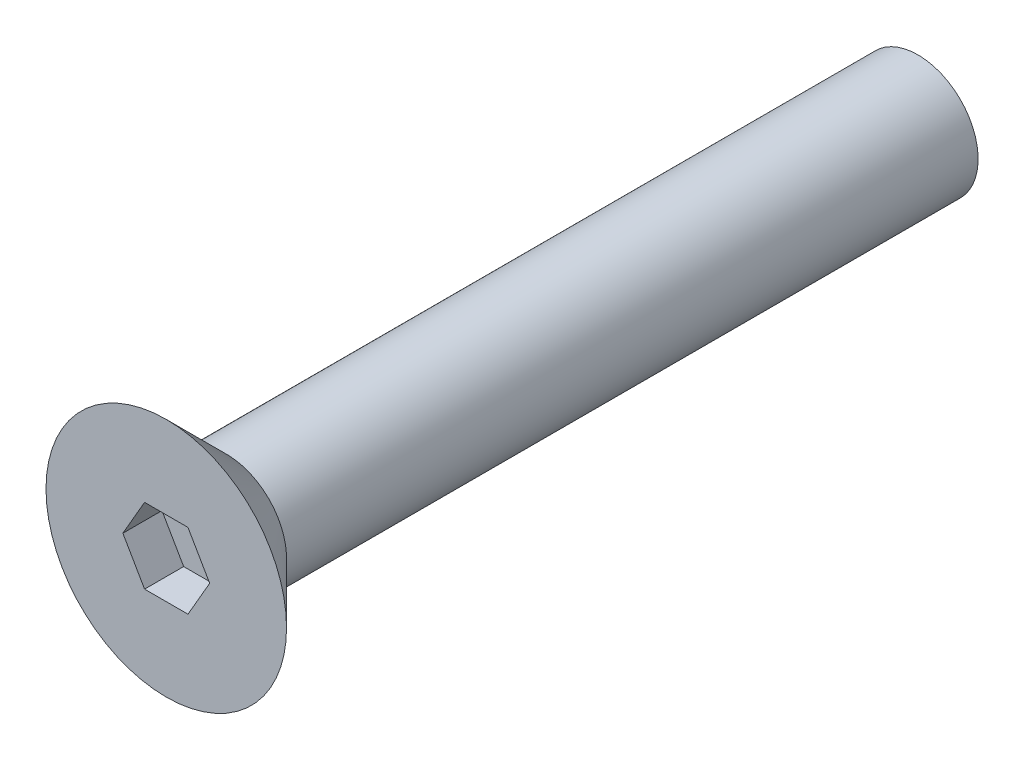
ISO-10303-21;
HEADER;
FILE_DESCRIPTION(('STEP AP214'),'2;1');
FILE_NAME('part.step','',(''),(''),'','','');
FILE_SCHEMA(('AUTOMOTIVE_DESIGN { 1 0 10303 214 1 1 1 1 }'));
ENDSEC;
DATA;
#1=APPLICATION_CONTEXT('core data for automotive mechanical design processes');
#2=APPLICATION_PROTOCOL_DEFINITION('international standard','automotive_design',2000,#1);
#3=PRODUCT_CONTEXT('',#1,'mechanical');
#4=PRODUCT('Part','Part','',(#3));
#5=PRODUCT_RELATED_PRODUCT_CATEGORY('part','',(#4));
#6=PRODUCT_DEFINITION_FORMATION('','',#4);
#7=PRODUCT_DEFINITION_CONTEXT('part definition',#1,'design');
#8=PRODUCT_DEFINITION('design','',#6,#7);
#9=PRODUCT_DEFINITION_SHAPE('','',#8);
#10=(LENGTH_UNIT() NAMED_UNIT(*) SI_UNIT(.MILLI.,.METRE.));
#11=(NAMED_UNIT(*) PLANE_ANGLE_UNIT() SI_UNIT($,.RADIAN.));
#12=(NAMED_UNIT(*) SI_UNIT($,.STERADIAN.) SOLID_ANGLE_UNIT());
#13=UNCERTAINTY_MEASURE_WITH_UNIT(LENGTH_MEASURE(1.E-05),#10,'distance_accuracy_value','');
#14=(GEOMETRIC_REPRESENTATION_CONTEXT(3) GLOBAL_UNCERTAINTY_ASSIGNED_CONTEXT((#13)) GLOBAL_UNIT_ASSIGNED_CONTEXT((#10,
#11,#12)) REPRESENTATION_CONTEXT('',''));
#15=CARTESIAN_POINT('',(0.,0.,0.));
#16=DIRECTION('',(0.,0.,1.));
#17=DIRECTION('',(1.,0.,0.));
#18=AXIS2_PLACEMENT_3D('',#15,#16,#17);
#19=CARTESIAN_POINT('',(0.,0.,-1.3));
#20=DIRECTION('',(0.,0.,1.));
#21=DIRECTION('',(1.,0.,0.));
#22=AXIS2_PLACEMENT_3D('',#19,#20,#21);
#23=PLANE('',#22);
#24=DIRECTION('',(-0.50000000000019,0.866025403784329,0.));
#25=VECTOR('',#24,1.);
#26=CARTESIAN_POINT('',(1.443375672974,0.,-1.3));
#27=LINE('',#26,#25);
#28=CARTESIAN_POINT('',(1.443375672974,0.,-1.3));
#29=VERTEX_POINT('',#28);
#30=CARTESIAN_POINT('',(0.721687836487,1.25,-1.3));
#31=VERTEX_POINT('',#30);
#32=EDGE_CURVE('E9',#29,#31,#27,.T.);
#33=ORIENTED_EDGE('',*,*,#32,.T.);
#34=DIRECTION('',(-1.,0.,0.));
#35=VECTOR('',#34,1.);
#36=CARTESIAN_POINT('',(0.721687836487,1.25,-1.3));
#37=LINE('',#36,#35);
#38=CARTESIAN_POINT('',(-0.721687836487,1.25,-1.3));
#39=VERTEX_POINT('',#38);
#40=EDGE_CURVE('E122',#31,#39,#37,.T.);
#41=ORIENTED_EDGE('',*,*,#40,.T.);
#42=DIRECTION('',(-0.50000000000019,-0.866025403784329,0.));
#43=VECTOR('',#42,1.);
#44=CARTESIAN_POINT('',(-0.721687836487,1.25,-1.3));
#45=LINE('',#44,#43);
#46=CARTESIAN_POINT('',(-1.443375672974,0.,-1.3));
#47=VERTEX_POINT('',#46);
#48=EDGE_CURVE('E102',#39,#47,#45,.T.);
#49=ORIENTED_EDGE('',*,*,#48,.T.);
#50=DIRECTION('',(0.50000000000019,-0.866025403784329,0.));
#51=VECTOR('',#50,1.);
#52=CARTESIAN_POINT('',(-1.443375672974,0.,-1.3));
#53=LINE('',#52,#51);
#54=CARTESIAN_POINT('',(-0.721687836487,-1.25,-1.3));
#55=VERTEX_POINT('',#54);
#56=EDGE_CURVE('E103',#47,#55,#53,.T.);
#57=ORIENTED_EDGE('',*,*,#56,.T.);
#58=DIRECTION('',(1.,0.,0.));
#59=VECTOR('',#58,1.);
#60=CARTESIAN_POINT('',(-0.721687836487,-1.25,-1.3));
#61=LINE('',#60,#59);
#62=CARTESIAN_POINT('',(0.721687836487,-1.25,-1.3));
#63=VERTEX_POINT('',#62);
#64=EDGE_CURVE('E118',#55,#63,#61,.T.);
#65=ORIENTED_EDGE('',*,*,#64,.T.);
#66=DIRECTION('',(0.50000000000019,0.866025403784329,0.));
#67=VECTOR('',#66,1.);
#68=CARTESIAN_POINT('',(0.721687836487,-1.25,-1.3));
#69=LINE('',#68,#67);
#70=EDGE_CURVE('E94',#63,#29,#69,.T.);
#71=ORIENTED_EDGE('',*,*,#70,.T.);
#72=EDGE_LOOP('',(#33,#41,#49,#57,#65,#71));
#73=FACE_BOUND('',#72,.T.);
#74=ADVANCED_FACE('F14',(#73),#23,.T.);
#75=CARTESIAN_POINT('',(1.443375672974,0.,-1.3));
#76=DIRECTION('',(-0.866025403784329,-0.50000000000019,0.));
#77=DIRECTION('',(-0.50000000000019,0.866025403784329,0.));
#78=AXIS2_PLACEMENT_3D('',#75,#76,#77);
#79=PLANE('',#78);
#80=ORIENTED_EDGE('',*,*,#32,.F.);
#81=DIRECTION('',(0.,0.,1.));
#82=VECTOR('',#81,1.);
#83=CARTESIAN_POINT('',(1.443375672974,0.,-1.3));
#84=LINE('',#83,#82);
#85=CARTESIAN_POINT('',(1.443375672974,0.,0.));
#86=VERTEX_POINT('',#85);
#87=EDGE_CURVE('E125',#29,#86,#84,.T.);
#88=ORIENTED_EDGE('',*,*,#87,.T.);
#89=DIRECTION('',(-0.50000000000019,0.866025403784329,0.));
#90=VECTOR('',#89,1.);
#91=CARTESIAN_POINT('',(1.262953713852,0.3125,0.));
#92=LINE('',#91,#90);
#93=CARTESIAN_POINT('',(0.721687836487,1.25,0.));
#94=VERTEX_POINT('',#93);
#95=EDGE_CURVE('E110',#86,#94,#92,.T.);
#96=ORIENTED_EDGE('',*,*,#95,.T.);
#97=DIRECTION('',(0.,0.,1.));
#98=VECTOR('',#97,1.);
#99=CARTESIAN_POINT('',(0.721687836487,1.25,-1.3));
#100=LINE('',#99,#98);
#101=EDGE_CURVE('E25',#31,#94,#100,.T.);
#102=ORIENTED_EDGE('',*,*,#101,.F.);
#103=EDGE_LOOP('',(#80,#88,#96,#102));
#104=FACE_BOUND('',#103,.T.);
#105=ADVANCED_FACE('F188',(#104),#79,.T.);
#106=CARTESIAN_POINT('',(0.721687836487,1.25,-1.3));
#107=DIRECTION('',(0.,-1.,0.));
#108=DIRECTION('',(-1.,0.,0.));
#109=AXIS2_PLACEMENT_3D('',#106,#107,#108);
#110=PLANE('',#109);
#111=ORIENTED_EDGE('',*,*,#40,.F.);
#112=ORIENTED_EDGE('',*,*,#101,.T.);
#113=DIRECTION('',(-1.,0.,0.));
#114=VECTOR('',#113,1.);
#115=CARTESIAN_POINT('',(0.360843918244,1.25,0.));
#116=LINE('',#115,#114);
#117=CARTESIAN_POINT('',(-0.721687836487,1.25,0.));
#118=VERTEX_POINT('',#117);
#119=EDGE_CURVE('E114',#94,#118,#116,.T.);
#120=ORIENTED_EDGE('',*,*,#119,.T.);
#121=DIRECTION('',(0.,0.,1.));
#122=VECTOR('',#121,1.);
#123=CARTESIAN_POINT('',(-0.721687836487,1.25,-1.3));
#124=LINE('',#123,#122);
#125=EDGE_CURVE('E106',#39,#118,#124,.T.);
#126=ORIENTED_EDGE('',*,*,#125,.F.);
#127=EDGE_LOOP('',(#111,#112,#120,#126));
#128=FACE_BOUND('',#127,.T.);
#129=ADVANCED_FACE('F155',(#128),#110,.T.);
#130=CARTESIAN_POINT('',(-0.721687836487,1.25,-1.3));
#131=DIRECTION('',(0.866025403784329,-0.50000000000019,0.));
#132=DIRECTION('',(0.,0.,-1.));
#133=AXIS2_PLACEMENT_3D('',#130,#131,#132);
#134=PLANE('',#133);
#135=ORIENTED_EDGE('',*,*,#48,.F.);
#136=ORIENTED_EDGE('',*,*,#125,.T.);
#137=DIRECTION('',(-0.50000000000019,-0.866025403784329,0.));
#138=VECTOR('',#137,1.);
#139=CARTESIAN_POINT('',(-0.902109795609,0.9375,0.));
#140=LINE('',#139,#138);
#141=CARTESIAN_POINT('',(-1.443375672974,0.,0.));
#142=VERTEX_POINT('',#141);
#143=EDGE_CURVE('E133',#118,#142,#140,.T.);
#144=ORIENTED_EDGE('',*,*,#143,.T.);
#145=DIRECTION('',(0.,0.,1.));
#146=VECTOR('',#145,1.);
#147=CARTESIAN_POINT('',(-1.443375672974,0.,-1.3));
#148=LINE('',#147,#146);
#149=EDGE_CURVE('E98',#47,#142,#148,.T.);
#150=ORIENTED_EDGE('',*,*,#149,.F.);
#151=EDGE_LOOP('',(#135,#136,#144,#150));
#152=FACE_BOUND('',#151,.T.);
#153=ADVANCED_FACE('F144',(#152),#134,.T.);
#154=CARTESIAN_POINT('',(-1.443375672974,0.,-1.3));
#155=DIRECTION('',(0.866025403784329,0.50000000000019,0.));
#156=DIRECTION('',(0.,0.,-1.));
#157=AXIS2_PLACEMENT_3D('',#154,#155,#156);
#158=PLANE('',#157);
#159=ORIENTED_EDGE('',*,*,#56,.F.);
#160=ORIENTED_EDGE('',*,*,#149,.T.);
#161=DIRECTION('',(0.50000000000019,-0.866025403784329,0.));
#162=VECTOR('',#161,1.);
#163=CARTESIAN_POINT('',(-1.262953713852,-0.3125,0.));
#164=LINE('',#163,#162);
#165=CARTESIAN_POINT('',(-0.721687836487,-1.25,0.));
#166=VERTEX_POINT('',#165);
#167=EDGE_CURVE('E129',#142,#166,#164,.T.);
#168=ORIENTED_EDGE('',*,*,#167,.T.);
#169=DIRECTION('',(0.,0.,1.));
#170=VECTOR('',#169,1.);
#171=CARTESIAN_POINT('',(-0.721687836487,-1.25,-1.3));
#172=LINE('',#171,#170);
#173=EDGE_CURVE('E115',#55,#166,#172,.T.);
#174=ORIENTED_EDGE('',*,*,#173,.F.);
#175=EDGE_LOOP('',(#159,#160,#168,#174));
#176=FACE_BOUND('',#175,.T.);
#177=ADVANCED_FACE('F264',(#176),#158,.T.);
#178=CARTESIAN_POINT('',(-0.721687836487,-1.25,-1.3));
#179=DIRECTION('',(0.,1.,0.));
#180=DIRECTION('',(1.,0.,0.));
#181=AXIS2_PLACEMENT_3D('',#178,#179,#180);
#182=PLANE('',#181);
#183=ORIENTED_EDGE('',*,*,#64,.F.);
#184=ORIENTED_EDGE('',*,*,#173,.T.);
#185=DIRECTION('',(1.,0.,0.));
#186=VECTOR('',#185,1.);
#187=CARTESIAN_POINT('',(-0.360843918244,-1.25,0.));
#188=LINE('',#187,#186);
#189=CARTESIAN_POINT('',(0.721687836487,-1.25,0.));
#190=VERTEX_POINT('',#189);
#191=EDGE_CURVE('E109',#166,#190,#188,.T.);
#192=ORIENTED_EDGE('',*,*,#191,.T.);
#193=DIRECTION('',(0.,0.,1.));
#194=VECTOR('',#193,1.);
#195=CARTESIAN_POINT('',(0.721687836487,-1.25,-1.3));
#196=LINE('',#195,#194);
#197=EDGE_CURVE('E96',#63,#190,#196,.T.);
#198=ORIENTED_EDGE('',*,*,#197,.F.);
#199=EDGE_LOOP('',(#183,#184,#192,#198));
#200=FACE_BOUND('',#199,.T.);
#201=ADVANCED_FACE('F182',(#200),#182,.T.);
#202=CARTESIAN_POINT('',(0.721687836487,-1.25,-1.3));
#203=DIRECTION('',(-0.866025403784329,0.50000000000019,0.));
#204=DIRECTION('',(0.,0.,1.));
#205=AXIS2_PLACEMENT_3D('',#202,#203,#204);
#206=PLANE('',#205);
#207=ORIENTED_EDGE('',*,*,#70,.F.);
#208=ORIENTED_EDGE('',*,*,#197,.T.);
#209=DIRECTION('',(0.50000000000019,0.866025403784329,0.));
#210=VECTOR('',#209,1.);
#211=CARTESIAN_POINT('',(0.902109795609,-0.9375,0.));
#212=LINE('',#211,#210);
#213=EDGE_CURVE('E97',#190,#86,#212,.T.);
#214=ORIENTED_EDGE('',*,*,#213,.T.);
#215=ORIENTED_EDGE('',*,*,#87,.F.);
#216=EDGE_LOOP('',(#207,#208,#214,#215));
#217=FACE_BOUND('',#216,.T.);
#218=ADVANCED_FACE('F16',(#217),#206,.T.);
#219=CARTESIAN_POINT('',(0.,0.,-25.));
#220=DIRECTION('',(0.,0.,-1.));
#221=DIRECTION('',(0.,-1.,0.));
#222=AXIS2_PLACEMENT_3D('',#219,#220,#221);
#223=PLANE('',#222);
#224=CARTESIAN_POINT('',(0.,0.,-25.));
#225=DIRECTION('',(0.,0.,-1.));
#226=DIRECTION('',(-1.,0.,0.));
#227=AXIS2_PLACEMENT_3D('',#224,#225,#226);
#228=CIRCLE('',#227,2.);
#229=CARTESIAN_POINT('',(-2.,0.,-25.));
#230=VERTEX_POINT('',#229);
#231=EDGE_CURVE('E77',#230,#230,#228,.T.);
#232=ORIENTED_EDGE('',*,*,#231,.T.);
#233=EDGE_LOOP('',(#232));
#234=FACE_BOUND('',#233,.T.);
#235=ADVANCED_FACE('F214',(#234),#223,.T.);
#236=CARTESIAN_POINT('',(0.,0.,0.));
#237=DIRECTION('',(0.,0.,-1.));
#238=DIRECTION('',(0.,-1.,0.));
#239=AXIS2_PLACEMENT_3D('',#236,#237,#238);
#240=PLANE('',#239);
#241=ORIENTED_EDGE('',*,*,#191,.F.);
#242=ORIENTED_EDGE('',*,*,#167,.F.);
#243=ORIENTED_EDGE('',*,*,#143,.F.);
#244=ORIENTED_EDGE('',*,*,#119,.F.);
#245=ORIENTED_EDGE('',*,*,#95,.F.);
#246=ORIENTED_EDGE('',*,*,#213,.F.);
#247=EDGE_LOOP('',(#241,#242,#243,#244,#245,#246));
#248=FACE_BOUND('',#247,.T.);
#249=CARTESIAN_POINT('',(0.,0.,0.));
#250=DIRECTION('',(0.,0.,-1.));
#251=DIRECTION('',(-1.,0.,0.));
#252=AXIS2_PLACEMENT_3D('',#249,#250,#251);
#253=CIRCLE('',#252,4.);
#254=CARTESIAN_POINT('',(-4.,0.,0.));
#255=VERTEX_POINT('',#254);
#256=EDGE_CURVE('E18',#255,#255,#253,.T.);
#257=ORIENTED_EDGE('',*,*,#256,.F.);
#258=EDGE_LOOP('',(#257));
#259=FACE_BOUND('',#258,.T.);
#260=ADVANCED_FACE('F159',(#248,#259),#240,.F.);
#261=CARTESIAN_POINT('',(0.,0.,0.));
#262=DIRECTION('',(0.,0.,-1.));
#263=DIRECTION('',(-1.,0.,0.));
#264=AXIS2_PLACEMENT_3D('',#261,#262,#263);
#265=CYLINDRICAL_SURFACE('',#264,2.);
#266=DIRECTION('',(0.,0.,-1.));
#267=VECTOR('',#266,1.);
#268=CARTESIAN_POINT('',(-2.,0.,0.));
#269=LINE('',#268,#267);
#270=CARTESIAN_POINT('',(-2.,0.,-2.));
#271=VERTEX_POINT('',#270);
#272=EDGE_CURVE('E71',#271,#230,#269,.T.);
#273=ORIENTED_EDGE('',*,*,#272,.T.);
#274=ORIENTED_EDGE('',*,*,#231,.F.);
#275=ORIENTED_EDGE('',*,*,#272,.F.);
#276=CARTESIAN_POINT('',(0.,0.,-2.));
#277=DIRECTION('',(0.,0.,-1.));
#278=DIRECTION('',(-1.,0.,0.));
#279=AXIS2_PLACEMENT_3D('',#276,#277,#278);
#280=CIRCLE('',#279,2.);
#281=EDGE_CURVE('E75',#271,#271,#280,.T.);
#282=ORIENTED_EDGE('',*,*,#281,.T.);
#283=EDGE_LOOP('',(#273,#274,#275,#282));
#284=FACE_BOUND('',#283,.T.);
#285=ADVANCED_FACE('F73',(#284),#265,.T.);
#286=CARTESIAN_POINT('',(0.,0.,0.));
#287=DIRECTION('',(0.,0.,1.));
#288=DIRECTION('',(-1.,0.,0.));
#289=AXIS2_PLACEMENT_3D('',#286,#287,#288);
#290=CONICAL_SURFACE('',#289,4.,0.785398163397);
#291=ORIENTED_EDGE('',*,*,#281,.F.);
#292=DIRECTION('',(0.707106781186548,0.,-0.707106781186548));
#293=VECTOR('',#292,1.);
#294=CARTESIAN_POINT('',(-4.,0.,0.));
#295=LINE('',#294,#293);
#296=EDGE_CURVE('E82',#255,#271,#295,.T.);
#297=ORIENTED_EDGE('',*,*,#296,.F.);
#298=ORIENTED_EDGE('',*,*,#256,.T.);
#299=ORIENTED_EDGE('',*,*,#296,.T.);
#300=EDGE_LOOP('',(#291,#297,#298,#299));
#301=FACE_BOUND('',#300,.T.);
#302=ADVANCED_FACE('F83',(#301),#290,.T.);
#303=CLOSED_SHELL('',(#74,#105,#129,#153,#177,#201,#218,#235,#260,#285,#302));
#304=MANIFOLD_SOLID_BREP('B1',#303);
#305=ADVANCED_BREP_SHAPE_REPRESENTATION('',(#18,#304),#14);
#306=SHAPE_DEFINITION_REPRESENTATION(#9,#305);
ENDSEC;
END-ISO-10303-21;
